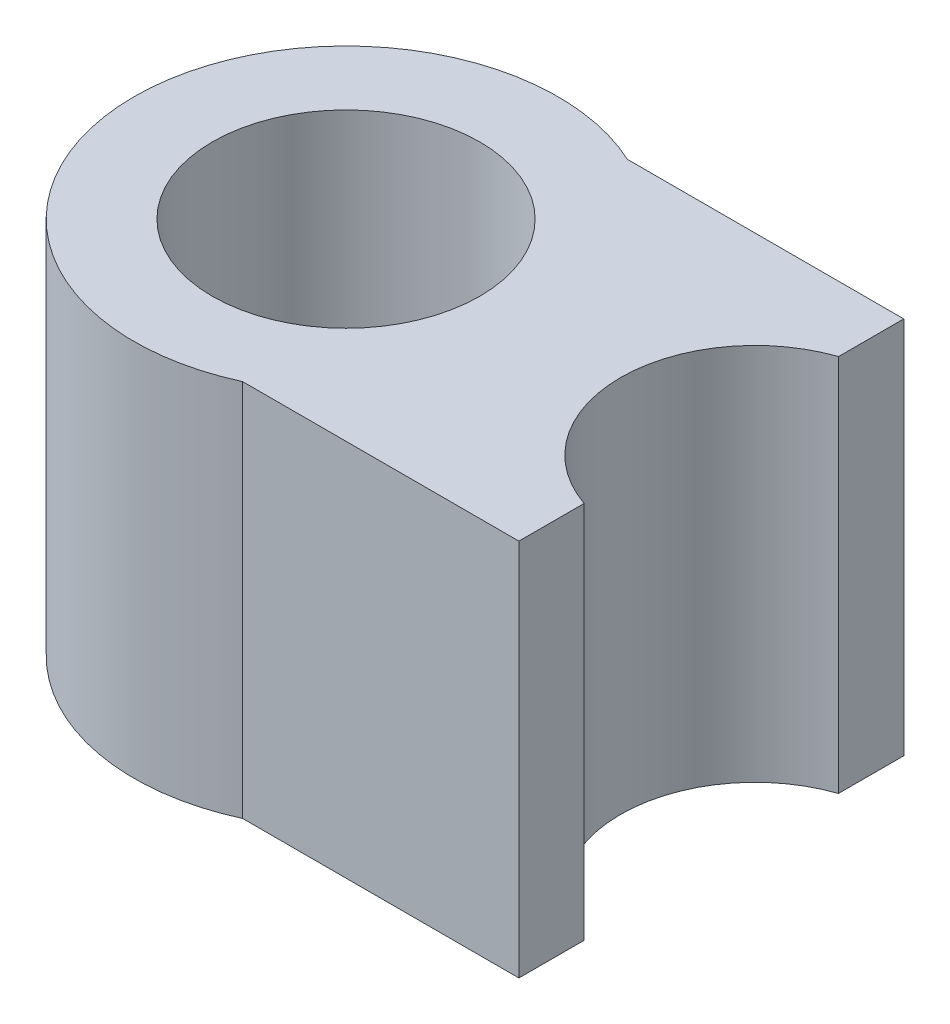
ISO-10303-21;
HEADER;
FILE_DESCRIPTION(('STEP AP214'),'2;1');
FILE_NAME('part.step','',(''),(''),'','','');
FILE_SCHEMA(('AUTOMOTIVE_DESIGN { 1 0 10303 214 1 1 1 1 }'));
ENDSEC;
DATA;
#1=APPLICATION_CONTEXT('core data for automotive mechanical design processes');
#2=APPLICATION_PROTOCOL_DEFINITION('international standard','automotive_design',2000,#1);
#3=PRODUCT_CONTEXT('',#1,'mechanical');
#4=PRODUCT('Part','Part','',(#3));
#5=PRODUCT_RELATED_PRODUCT_CATEGORY('part','',(#4));
#6=PRODUCT_DEFINITION_FORMATION('','',#4);
#7=PRODUCT_DEFINITION_CONTEXT('part definition',#1,'design');
#8=PRODUCT_DEFINITION('design','',#6,#7);
#9=PRODUCT_DEFINITION_SHAPE('','',#8);
#10=(LENGTH_UNIT() NAMED_UNIT(*) SI_UNIT(.MILLI.,.METRE.));
#11=(NAMED_UNIT(*) PLANE_ANGLE_UNIT() SI_UNIT($,.RADIAN.));
#12=(NAMED_UNIT(*) SI_UNIT($,.STERADIAN.) SOLID_ANGLE_UNIT());
#13=UNCERTAINTY_MEASURE_WITH_UNIT(LENGTH_MEASURE(1.E-05),#10,'distance_accuracy_value','');
#14=(GEOMETRIC_REPRESENTATION_CONTEXT(3) GLOBAL_UNCERTAINTY_ASSIGNED_CONTEXT((#13)) GLOBAL_UNIT_ASSIGNED_CONTEXT((#10,
#11,#12)) REPRESENTATION_CONTEXT('',''));
#15=CARTESIAN_POINT('',(0.,0.,0.));
#16=DIRECTION('',(0.,0.,1.));
#17=DIRECTION('',(1.,0.,0.));
#18=AXIS2_PLACEMENT_3D('',#15,#16,#17);
#19=CARTESIAN_POINT('',(-0.56,1.16,0.));
#20=DIRECTION('',(0.,-1.,0.));
#21=DIRECTION('',(0.,0.,-1.));
#22=AXIS2_PLACEMENT_3D('',#19,#20,#21);
#23=CYLINDRICAL_SURFACE('',#22,0.41);
#24=CARTESIAN_POINT('',(-0.56,1.16,0.));
#25=DIRECTION('',(0.,-1.,0.));
#26=DIRECTION('',(0.,0.,-1.));
#27=AXIS2_PLACEMENT_3D('',#24,#25,#26);
#28=CIRCLE('',#27,0.41);
#29=CARTESIAN_POINT('',(-0.56,1.16,-0.41));
#30=VERTEX_POINT('',#29);
#31=EDGE_CURVE('E19',#30,#30,#28,.F.);
#32=ORIENTED_EDGE('',*,*,#31,.T.);
#33=EDGE_LOOP('',(#32));
#34=FACE_BOUND('',#33,.T.);
#35=CARTESIAN_POINT('',(-0.56,0.,0.));
#36=DIRECTION('',(0.,-1.,0.));
#37=DIRECTION('',(0.,0.,-1.));
#38=AXIS2_PLACEMENT_3D('',#35,#36,#37);
#39=CIRCLE('',#38,0.41);
#40=CARTESIAN_POINT('',(-0.56,0.,-0.41));
#41=VERTEX_POINT('',#40);
#42=EDGE_CURVE('E106',#41,#41,#39,.F.);
#43=ORIENTED_EDGE('',*,*,#42,.F.);
#44=EDGE_LOOP('',(#43));
#45=FACE_BOUND('',#44,.T.);
#46=ADVANCED_FACE('F16',(#34,#45),#23,.F.);
#47=CARTESIAN_POINT('',(0.56,1.16,0.59));
#48=DIRECTION('',(-1.,0.,0.));
#49=DIRECTION('',(0.,0.,1.));
#50=AXIS2_PLACEMENT_3D('',#47,#48,#49);
#51=PLANE('',#50);
#52=DIRECTION('',(0.,0.,-1.));
#53=VECTOR('',#52,1.);
#54=CARTESIAN_POINT('',(0.56,0.,0.));
#55=LINE('',#54,#53);
#56=CARTESIAN_POINT('',(0.56,0.,-0.59));
#57=VERTEX_POINT('',#56);
#58=CARTESIAN_POINT('',(0.559999999999898,0.,-0.390000000000633));
#59=VERTEX_POINT('',#58);
#60=EDGE_CURVE('E98',#57,#59,#55,.F.);
#61=ORIENTED_EDGE('',*,*,#60,.F.);
#62=DIRECTION('',(0.,1.,0.));
#63=VECTOR('',#62,1.);
#64=CARTESIAN_POINT('',(0.56,1.16,-0.59));
#65=LINE('',#64,#63);
#66=CARTESIAN_POINT('',(0.56,1.16,-0.59));
#67=VERTEX_POINT('',#66);
#68=EDGE_CURVE('E74',#57,#67,#65,.T.);
#69=ORIENTED_EDGE('',*,*,#68,.T.);
#70=DIRECTION('',(0.,0.,-1.));
#71=VECTOR('',#70,1.);
#72=CARTESIAN_POINT('',(0.56,1.16,0.));
#73=LINE('',#72,#71);
#74=CARTESIAN_POINT('',(0.559999999999898,1.16,-0.390000000000633));
#75=VERTEX_POINT('',#74);
#76=EDGE_CURVE('E109',#67,#75,#73,.F.);
#77=ORIENTED_EDGE('',*,*,#76,.T.);
#78=DIRECTION('',(0.,-1.,0.));
#79=VECTOR('',#78,1.);
#80=CARTESIAN_POINT('',(0.559999999999795,1.16,-0.390000000000597));
#81=LINE('',#80,#79);
#82=EDGE_CURVE('E134',#75,#59,#81,.T.);
#83=ORIENTED_EDGE('',*,*,#82,.T.);
#84=EDGE_LOOP('',(#61,#69,#77,#83));
#85=FACE_BOUND('',#84,.T.);
#86=ADVANCED_FACE('F154',(#85),#51,.F.);
#87=CARTESIAN_POINT('',(0.693899674114,1.16,0.));
#88=DIRECTION('',(0.,-1.,0.));
#89=DIRECTION('',(0.,0.,-1.));
#90=AXIS2_PLACEMENT_3D('',#87,#88,#89);
#91=CYLINDRICAL_SURFACE('',#90,0.412345877545);
#92=CARTESIAN_POINT('',(0.693899674114,1.16,0.));
#93=DIRECTION('',(0.,-1.,0.));
#94=DIRECTION('',(0.,0.,-1.));
#95=AXIS2_PLACEMENT_3D('',#92,#93,#94);
#96=CIRCLE('',#95,0.412345877545);
#97=CARTESIAN_POINT('',(0.56,1.16,0.390000000000334));
#98=VERTEX_POINT('',#97);
#99=EDGE_CURVE('E111',#75,#98,#96,.F.);
#100=ORIENTED_EDGE('',*,*,#99,.T.);
#101=DIRECTION('',(0.,1.,0.));
#102=VECTOR('',#101,1.);
#103=CARTESIAN_POINT('',(0.56,1.16,0.39));
#104=LINE('',#103,#102);
#105=CARTESIAN_POINT('',(0.56,0.,0.390000000000334));
#106=VERTEX_POINT('',#105);
#107=EDGE_CURVE('E58',#98,#106,#104,.F.);
#108=ORIENTED_EDGE('',*,*,#107,.T.);
#109=CARTESIAN_POINT('',(0.693899674114,0.,0.));
#110=DIRECTION('',(0.,-1.,0.));
#111=DIRECTION('',(0.,0.,-1.));
#112=AXIS2_PLACEMENT_3D('',#109,#110,#111);
#113=CIRCLE('',#112,0.412345877545);
#114=EDGE_CURVE('E96',#59,#106,#113,.F.);
#115=ORIENTED_EDGE('',*,*,#114,.F.);
#116=ORIENTED_EDGE('',*,*,#82,.F.);
#117=EDGE_LOOP('',(#100,#108,#115,#116));
#118=FACE_BOUND('',#117,.T.);
#119=ADVANCED_FACE('F141',(#118),#91,.F.);
#120=CARTESIAN_POINT('',(0.56,1.16,0.59));
#121=DIRECTION('',(-1.,0.,0.));
#122=DIRECTION('',(0.,0.,1.));
#123=AXIS2_PLACEMENT_3D('',#120,#121,#122);
#124=PLANE('',#123);
#125=DIRECTION('',(0.,0.,-1.));
#126=VECTOR('',#125,1.);
#127=CARTESIAN_POINT('',(0.56,1.16,0.));
#128=LINE('',#127,#126);
#129=CARTESIAN_POINT('',(0.56,1.16,0.59));
#130=VERTEX_POINT('',#129);
#131=EDGE_CURVE('E62',#98,#130,#128,.F.);
#132=ORIENTED_EDGE('',*,*,#131,.T.);
#133=DIRECTION('',(0.,1.,0.));
#134=VECTOR('',#133,1.);
#135=CARTESIAN_POINT('',(0.56,1.16,0.59));
#136=LINE('',#135,#134);
#137=CARTESIAN_POINT('',(0.56,0.,0.59));
#138=VERTEX_POINT('',#137);
#139=EDGE_CURVE('E77',#130,#138,#136,.F.);
#140=ORIENTED_EDGE('',*,*,#139,.T.);
#141=DIRECTION('',(0.,0.,-1.));
#142=VECTOR('',#141,1.);
#143=CARTESIAN_POINT('',(0.56,0.,0.));
#144=LINE('',#143,#142);
#145=EDGE_CURVE('E81',#106,#138,#144,.F.);
#146=ORIENTED_EDGE('',*,*,#145,.F.);
#147=ORIENTED_EDGE('',*,*,#107,.F.);
#148=EDGE_LOOP('',(#132,#140,#146,#147));
#149=FACE_BOUND('',#148,.T.);
#150=ADVANCED_FACE('F79',(#149),#124,.F.);
#151=CARTESIAN_POINT('',(-0.56,1.16,0.59));
#152=DIRECTION('',(0.,0.,-1.));
#153=DIRECTION('',(-1.,0.,0.));
#154=AXIS2_PLACEMENT_3D('',#151,#152,#153);
#155=PLANE('',#154);
#156=DIRECTION('',(1.,0.,0.));
#157=VECTOR('',#156,1.);
#158=CARTESIAN_POINT('',(0.,0.,0.59));
#159=LINE('',#158,#157);
#160=CARTESIAN_POINT('',(-0.287236366060166,0.,0.589999999999946));
#161=VERTEX_POINT('',#160);
#162=EDGE_CURVE('E86',#138,#161,#159,.F.);
#163=ORIENTED_EDGE('',*,*,#162,.F.);
#164=ORIENTED_EDGE('',*,*,#139,.F.);
#165=DIRECTION('',(1.,0.,0.));
#166=VECTOR('',#165,1.);
#167=CARTESIAN_POINT('',(0.,1.16,0.59));
#168=LINE('',#167,#166);
#169=CARTESIAN_POINT('',(-0.287236366060166,1.16,0.589999999999946));
#170=VERTEX_POINT('',#169);
#171=EDGE_CURVE('E116',#130,#170,#168,.F.);
#172=ORIENTED_EDGE('',*,*,#171,.T.);
#173=DIRECTION('',(0.,-1.,0.));
#174=VECTOR('',#173,1.);
#175=CARTESIAN_POINT('',(-0.28723636606005,1.16,0.589999999999892));
#176=LINE('',#175,#174);
#177=EDGE_CURVE('E89',#161,#170,#176,.F.);
#178=ORIENTED_EDGE('',*,*,#177,.F.);
#179=EDGE_LOOP('',(#163,#164,#172,#178));
#180=FACE_BOUND('',#179,.T.);
#181=ADVANCED_FACE('F87',(#180),#155,.F.);
#182=CARTESIAN_POINT('',(-0.56,1.16,-0.59));
#183=DIRECTION('',(0.,0.,1.));
#184=DIRECTION('',(1.,0.,0.));
#185=AXIS2_PLACEMENT_3D('',#182,#183,#184);
#186=PLANE('',#185);
#187=DIRECTION('',(1.,0.,0.));
#188=VECTOR('',#187,1.);
#189=CARTESIAN_POINT('',(0.,1.16,-0.59));
#190=LINE('',#189,#188);
#191=CARTESIAN_POINT('',(-0.287236366060166,1.16,-0.589999999999946));
#192=VERTEX_POINT('',#191);
#193=EDGE_CURVE('E112',#192,#67,#190,.T.);
#194=ORIENTED_EDGE('',*,*,#193,.T.);
#195=ORIENTED_EDGE('',*,*,#68,.F.);
#196=DIRECTION('',(1.,0.,0.));
#197=VECTOR('',#196,1.);
#198=CARTESIAN_POINT('',(0.,0.,-0.59));
#199=LINE('',#198,#197);
#200=CARTESIAN_POINT('',(-0.287236366060166,0.,-0.589999999999946));
#201=VERTEX_POINT('',#200);
#202=EDGE_CURVE('E90',#201,#57,#199,.T.);
#203=ORIENTED_EDGE('',*,*,#202,.F.);
#204=DIRECTION('',(0.,-1.,0.));
#205=VECTOR('',#204,1.);
#206=CARTESIAN_POINT('',(-0.28723636606005,1.16,-0.589999999999892));
#207=LINE('',#206,#205);
#208=EDGE_CURVE('E128',#192,#201,#207,.T.);
#209=ORIENTED_EDGE('',*,*,#208,.F.);
#210=EDGE_LOOP('',(#194,#195,#203,#209));
#211=FACE_BOUND('',#210,.T.);
#212=ADVANCED_FACE('F150',(#211),#186,.F.);
#213=CARTESIAN_POINT('',(0.,1.16,0.));
#214=DIRECTION('',(0.,-1.,0.));
#215=DIRECTION('',(0.,0.,-1.));
#216=AXIS2_PLACEMENT_3D('',#213,#214,#215);
#217=PLANE('',#216);
#218=ORIENTED_EDGE('',*,*,#76,.F.);
#219=ORIENTED_EDGE('',*,*,#193,.F.);
#220=CARTESIAN_POINT('',(-0.56,1.16,0.));
#221=DIRECTION('',(0.,-1.,0.));
#222=DIRECTION('',(0.,0.,-1.));
#223=AXIS2_PLACEMENT_3D('',#220,#221,#222);
#224=CIRCLE('',#223,0.65);
#225=EDGE_CURVE('E25',#170,#192,#224,.T.);
#226=ORIENTED_EDGE('',*,*,#225,.F.);
#227=ORIENTED_EDGE('',*,*,#171,.F.);
#228=ORIENTED_EDGE('',*,*,#131,.F.);
#229=ORIENTED_EDGE('',*,*,#99,.F.);
#230=EDGE_LOOP('',(#218,#219,#226,#227,#228,#229));
#231=FACE_BOUND('',#230,.T.);
#232=ORIENTED_EDGE('',*,*,#31,.F.);
#233=EDGE_LOOP('',(#232));
#234=FACE_BOUND('',#233,.T.);
#235=ADVANCED_FACE('F143',(#231,#234),#217,.F.);
#236=CARTESIAN_POINT('',(0.,0.,0.));
#237=DIRECTION('',(0.,-1.,0.));
#238=DIRECTION('',(0.,0.,-1.));
#239=AXIS2_PLACEMENT_3D('',#236,#237,#238);
#240=PLANE('',#239);
#241=CARTESIAN_POINT('',(-0.56,0.,0.));
#242=DIRECTION('',(0.,-1.,0.));
#243=DIRECTION('',(0.,0.,-1.));
#244=AXIS2_PLACEMENT_3D('',#241,#242,#243);
#245=CIRCLE('',#244,0.65);
#246=EDGE_CURVE('E10',#201,#161,#245,.F.);
#247=ORIENTED_EDGE('',*,*,#246,.F.);
#248=ORIENTED_EDGE('',*,*,#202,.T.);
#249=ORIENTED_EDGE('',*,*,#60,.T.);
#250=ORIENTED_EDGE('',*,*,#114,.T.);
#251=ORIENTED_EDGE('',*,*,#145,.T.);
#252=ORIENTED_EDGE('',*,*,#162,.T.);
#253=EDGE_LOOP('',(#247,#248,#249,#250,#251,#252));
#254=FACE_BOUND('',#253,.T.);
#255=ORIENTED_EDGE('',*,*,#42,.T.);
#256=EDGE_LOOP('',(#255));
#257=FACE_BOUND('',#256,.T.);
#258=ADVANCED_FACE('F92',(#254,#257),#240,.T.);
#259=CARTESIAN_POINT('',(-0.56,1.16,0.));
#260=DIRECTION('',(0.,-1.,0.));
#261=DIRECTION('',(0.,0.,-1.));
#262=AXIS2_PLACEMENT_3D('',#259,#260,#261);
#263=CYLINDRICAL_SURFACE('',#262,0.65);
#264=ORIENTED_EDGE('',*,*,#225,.T.);
#265=ORIENTED_EDGE('',*,*,#208,.T.);
#266=ORIENTED_EDGE('',*,*,#246,.T.);
#267=ORIENTED_EDGE('',*,*,#177,.T.);
#268=EDGE_LOOP('',(#264,#265,#266,#267));
#269=FACE_BOUND('',#268,.T.);
#270=ADVANCED_FACE('F146',(#269),#263,.T.);
#271=CLOSED_SHELL('',(#46,#86,#119,#150,#181,#212,#235,#258,#270));
#272=MANIFOLD_SOLID_BREP('B1',#271);
#273=ADVANCED_BREP_SHAPE_REPRESENTATION('',(#18,#272),#14);
#274=SHAPE_DEFINITION_REPRESENTATION(#9,#273);
ENDSEC;
END-ISO-10303-21;
